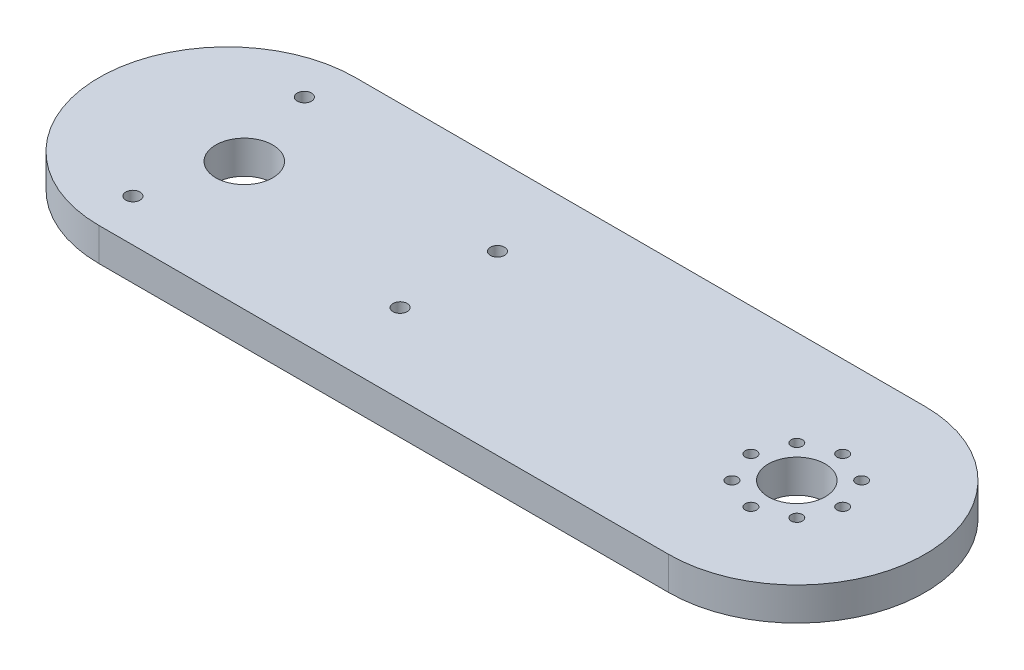
ISO-10303-21;
HEADER;
FILE_DESCRIPTION(('STEP AP214'),'2;1');
FILE_NAME('part.step','',(''),(''),'','','');
FILE_SCHEMA(('AUTOMOTIVE_DESIGN { 1 0 10303 214 1 1 1 1 }'));
ENDSEC;
DATA;
#1=APPLICATION_CONTEXT('core data for automotive mechanical design processes');
#2=APPLICATION_PROTOCOL_DEFINITION('international standard','automotive_design',2000,#1);
#3=PRODUCT_CONTEXT('',#1,'mechanical');
#4=PRODUCT('Part','Part','',(#3));
#5=PRODUCT_RELATED_PRODUCT_CATEGORY('part','',(#4));
#6=PRODUCT_DEFINITION_FORMATION('','',#4);
#7=PRODUCT_DEFINITION_CONTEXT('part definition',#1,'design');
#8=PRODUCT_DEFINITION('design','',#6,#7);
#9=PRODUCT_DEFINITION_SHAPE('','',#8);
#10=(LENGTH_UNIT() NAMED_UNIT(*) SI_UNIT(.MILLI.,.METRE.));
#11=(NAMED_UNIT(*) PLANE_ANGLE_UNIT() SI_UNIT($,.RADIAN.));
#12=(NAMED_UNIT(*) SI_UNIT($,.STERADIAN.) SOLID_ANGLE_UNIT());
#13=UNCERTAINTY_MEASURE_WITH_UNIT(LENGTH_MEASURE(1.E-05),#10,'distance_accuracy_value','');
#14=(GEOMETRIC_REPRESENTATION_CONTEXT(3) GLOBAL_UNCERTAINTY_ASSIGNED_CONTEXT((#13)) GLOBAL_UNIT_ASSIGNED_CONTEXT((#10,
#11,#12)) REPRESENTATION_CONTEXT('',''));
#15=CARTESIAN_POINT('',(0.,0.,0.));
#16=DIRECTION('',(0.,0.,1.));
#17=DIRECTION('',(1.,0.,0.));
#18=AXIS2_PLACEMENT_3D('',#15,#16,#17);
#19=CARTESIAN_POINT('',(50.,2.9,0.));
#20=DIRECTION('',(0.,-1.,0.));
#21=DIRECTION('',(0.,0.,-1.));
#22=AXIS2_PLACEMENT_3D('',#19,#20,#21);
#23=CYLINDRICAL_SURFACE('',#22,22.5);
#24=CARTESIAN_POINT('',(50.,-2.9,0.));
#25=DIRECTION('',(0.,1.,0.));
#26=DIRECTION('',(0.,0.,1.));
#27=AXIS2_PLACEMENT_3D('',#24,#25,#26);
#28=CIRCLE('',#27,22.5);
#29=CARTESIAN_POINT('',(50.,-2.9,22.5));
#30=VERTEX_POINT('',#29);
#31=CARTESIAN_POINT('',(50.,-2.9,-22.5));
#32=VERTEX_POINT('',#31);
#33=EDGE_CURVE('E107',#30,#32,#28,.T.);
#34=ORIENTED_EDGE('',*,*,#33,.T.);
#35=DIRECTION('',(0.,-1.,0.));
#36=VECTOR('',#35,1.);
#37=CARTESIAN_POINT('',(50.,2.9,-22.5));
#38=LINE('',#37,#36);
#39=CARTESIAN_POINT('',(50.,2.9,-22.5));
#40=VERTEX_POINT('',#39);
#41=EDGE_CURVE('E11',#40,#32,#38,.T.);
#42=ORIENTED_EDGE('',*,*,#41,.F.);
#43=CARTESIAN_POINT('',(50.,2.9,0.));
#44=DIRECTION('',(0.,1.,0.));
#45=DIRECTION('',(0.,0.,1.));
#46=AXIS2_PLACEMENT_3D('',#43,#44,#45);
#47=CIRCLE('',#46,22.5);
#48=CARTESIAN_POINT('',(50.,2.9,22.5));
#49=VERTEX_POINT('',#48);
#50=EDGE_CURVE('E91',#49,#40,#47,.T.);
#51=ORIENTED_EDGE('',*,*,#50,.F.);
#52=DIRECTION('',(0.,-1.,0.));
#53=VECTOR('',#52,1.);
#54=CARTESIAN_POINT('',(50.,2.9,22.5));
#55=LINE('',#54,#53);
#56=EDGE_CURVE('E103',#49,#30,#55,.T.);
#57=ORIENTED_EDGE('',*,*,#56,.T.);
#58=EDGE_LOOP('',(#34,#42,#51,#57));
#59=FACE_BOUND('',#58,.T.);
#60=ADVANCED_FACE('F39',(#59),#23,.T.);
#61=CARTESIAN_POINT('',(50.,2.9,-22.5));
#62=DIRECTION('',(0.,0.,1.));
#63=DIRECTION('',(1.,0.,0.));
#64=AXIS2_PLACEMENT_3D('',#61,#62,#63);
#65=PLANE('',#64);
#66=DIRECTION('',(-1.,0.,0.));
#67=VECTOR('',#66,1.);
#68=CARTESIAN_POINT('',(50.,-2.9,-22.5));
#69=LINE('',#68,#67);
#70=CARTESIAN_POINT('',(-50.,-2.9,-22.5));
#71=VERTEX_POINT('',#70);
#72=EDGE_CURVE('E96',#32,#71,#69,.T.);
#73=ORIENTED_EDGE('',*,*,#72,.T.);
#74=DIRECTION('',(0.,-1.,0.));
#75=VECTOR('',#74,1.);
#76=CARTESIAN_POINT('',(-50.,2.9,-22.5));
#77=LINE('',#76,#75);
#78=CARTESIAN_POINT('',(-50.,2.9,-22.5));
#79=VERTEX_POINT('',#78);
#80=EDGE_CURVE('E48',#79,#71,#77,.T.);
#81=ORIENTED_EDGE('',*,*,#80,.F.);
#82=DIRECTION('',(-1.,0.,0.));
#83=VECTOR('',#82,1.);
#84=CARTESIAN_POINT('',(50.,2.9,-22.5));
#85=LINE('',#84,#83);
#86=EDGE_CURVE('E86',#40,#79,#85,.T.);
#87=ORIENTED_EDGE('',*,*,#86,.F.);
#88=ORIENTED_EDGE('',*,*,#41,.T.);
#89=EDGE_LOOP('',(#73,#81,#87,#88));
#90=FACE_BOUND('',#89,.T.);
#91=ADVANCED_FACE('F95',(#90),#65,.F.);
#92=CARTESIAN_POINT('',(-50.,2.9,0.));
#93=DIRECTION('',(0.,-1.,0.));
#94=DIRECTION('',(0.,0.,-1.));
#95=AXIS2_PLACEMENT_3D('',#92,#93,#94);
#96=CYLINDRICAL_SURFACE('',#95,22.5);
#97=CARTESIAN_POINT('',(-50.,-2.9,0.));
#98=DIRECTION('',(0.,1.,0.));
#99=DIRECTION('',(0.,0.,1.));
#100=AXIS2_PLACEMENT_3D('',#97,#98,#99);
#101=CIRCLE('',#100,22.5);
#102=CARTESIAN_POINT('',(-50.,-2.9,22.5));
#103=VERTEX_POINT('',#102);
#104=EDGE_CURVE('E73',#71,#103,#101,.T.);
#105=ORIENTED_EDGE('',*,*,#104,.T.);
#106=DIRECTION('',(0.,-1.,0.));
#107=VECTOR('',#106,1.);
#108=CARTESIAN_POINT('',(-50.,2.9,22.5));
#109=LINE('',#108,#107);
#110=CARTESIAN_POINT('',(-50.,2.9,22.5));
#111=VERTEX_POINT('',#110);
#112=EDGE_CURVE('E98',#111,#103,#109,.T.);
#113=ORIENTED_EDGE('',*,*,#112,.F.);
#114=CARTESIAN_POINT('',(-50.,2.9,0.));
#115=DIRECTION('',(0.,1.,0.));
#116=DIRECTION('',(0.,0.,1.));
#117=AXIS2_PLACEMENT_3D('',#114,#115,#116);
#118=CIRCLE('',#117,22.5);
#119=EDGE_CURVE('E89',#79,#111,#118,.T.);
#120=ORIENTED_EDGE('',*,*,#119,.F.);
#121=ORIENTED_EDGE('',*,*,#80,.T.);
#122=EDGE_LOOP('',(#105,#113,#120,#121));
#123=FACE_BOUND('',#122,.T.);
#124=ADVANCED_FACE('F99',(#123),#96,.T.);
#125=CARTESIAN_POINT('',(50.,2.9,22.5));
#126=DIRECTION('',(0.,0.,-1.));
#127=DIRECTION('',(-1.,0.,0.));
#128=AXIS2_PLACEMENT_3D('',#125,#126,#127);
#129=PLANE('',#128);
#130=DIRECTION('',(1.,0.,0.));
#131=VECTOR('',#130,1.);
#132=CARTESIAN_POINT('',(50.,-2.9,22.5));
#133=LINE('',#132,#131);
#134=EDGE_CURVE('E79',#103,#30,#133,.T.);
#135=ORIENTED_EDGE('',*,*,#134,.T.);
#136=ORIENTED_EDGE('',*,*,#56,.F.);
#137=DIRECTION('',(1.,0.,0.));
#138=VECTOR('',#137,1.);
#139=CARTESIAN_POINT('',(50.,2.9,22.5));
#140=LINE('',#139,#138);
#141=EDGE_CURVE('E56',#111,#49,#140,.T.);
#142=ORIENTED_EDGE('',*,*,#141,.F.);
#143=ORIENTED_EDGE('',*,*,#112,.T.);
#144=EDGE_LOOP('',(#135,#136,#142,#143));
#145=FACE_BOUND('',#144,.T.);
#146=ADVANCED_FACE('F121',(#145),#129,.F.);
#147=CARTESIAN_POINT('',(50.,2.9,0.));
#148=DIRECTION('',(0.,1.,0.));
#149=DIRECTION('',(0.,0.,1.));
#150=AXIS2_PLACEMENT_3D('',#147,#148,#149);
#151=PLANE('',#150);
#152=CARTESIAN_POINT('',(-51.5,2.9,15.05));
#153=DIRECTION('',(0.,1.,0.));
#154=DIRECTION('',(0.,0.,1.));
#155=AXIS2_PLACEMENT_3D('',#152,#153,#154);
#156=CIRCLE('',#155,1.25);
#157=CARTESIAN_POINT('',(-51.5,2.9,16.3));
#158=VERTEX_POINT('',#157);
#159=EDGE_CURVE('E196',#158,#158,#156,.T.);
#160=ORIENTED_EDGE('',*,*,#159,.F.);
#161=EDGE_LOOP('',(#160));
#162=FACE_BOUND('',#161,.T.);
#163=CARTESIAN_POINT('',(-47.,2.9,0.));
#164=DIRECTION('',(0.,1.,0.));
#165=DIRECTION('',(0.,0.,1.));
#166=AXIS2_PLACEMENT_3D('',#163,#164,#165);
#167=CIRCLE('',#166,5.);
#168=CARTESIAN_POINT('',(-47.,2.9,5.));
#169=VERTEX_POINT('',#168);
#170=EDGE_CURVE('E203',#169,#169,#167,.T.);
#171=ORIENTED_EDGE('',*,*,#170,.F.);
#172=EDGE_LOOP('',(#171));
#173=FACE_BOUND('',#172,.T.);
#174=CARTESIAN_POINT('',(-11.1,2.9,-8.55));
#175=DIRECTION('',(0.,1.,0.));
#176=DIRECTION('',(0.,0.,1.));
#177=AXIS2_PLACEMENT_3D('',#174,#175,#176);
#178=CIRCLE('',#177,1.25);
#179=CARTESIAN_POINT('',(-11.1,2.9,-7.3));
#180=VERTEX_POINT('',#179);
#181=EDGE_CURVE('E207',#180,#180,#178,.T.);
#182=ORIENTED_EDGE('',*,*,#181,.F.);
#183=EDGE_LOOP('',(#182));
#184=FACE_BOUND('',#183,.T.);
#185=CARTESIAN_POINT('',(-11.1,2.9,8.55));
#186=DIRECTION('',(0.,1.,0.));
#187=DIRECTION('',(0.,0.,1.));
#188=AXIS2_PLACEMENT_3D('',#185,#186,#187);
#189=CIRCLE('',#188,1.25);
#190=CARTESIAN_POINT('',(-11.1,2.9,9.8));
#191=VERTEX_POINT('',#190);
#192=EDGE_CURVE('E211',#191,#191,#189,.T.);
#193=ORIENTED_EDGE('',*,*,#192,.F.);
#194=EDGE_LOOP('',(#193));
#195=FACE_BOUND('',#194,.T.);
#196=CARTESIAN_POINT('',(-51.5,2.9,-15.05));
#197=DIRECTION('',(0.,1.,0.));
#198=DIRECTION('',(0.,0.,1.));
#199=AXIS2_PLACEMENT_3D('',#196,#197,#198);
#200=CIRCLE('',#199,1.25);
#201=CARTESIAN_POINT('',(-51.5,2.9,-13.8));
#202=VERTEX_POINT('',#201);
#203=EDGE_CURVE('E215',#202,#202,#200,.T.);
#204=ORIENTED_EDGE('',*,*,#203,.F.);
#205=EDGE_LOOP('',(#204));
#206=FACE_BOUND('',#205,.T.);
#207=CARTESIAN_POINT('',(50.,2.9,0.));
#208=DIRECTION('',(0.,1.,0.));
#209=DIRECTION('',(0.,0.,1.));
#210=AXIS2_PLACEMENT_3D('',#207,#208,#209);
#211=CIRCLE('',#210,5.);
#212=CARTESIAN_POINT('',(50.,2.9,4.99999999999998));
#213=VERTEX_POINT('',#212);
#214=EDGE_CURVE('E192',#213,#213,#211,.T.);
#215=ORIENTED_EDGE('',*,*,#214,.F.);
#216=EDGE_LOOP('',(#215));
#217=FACE_BOUND('',#216,.T.);
#218=CARTESIAN_POINT('',(41.95,2.9,0.));
#219=DIRECTION('',(0.,1.,0.));
#220=DIRECTION('',(0.,0.,1.));
#221=AXIS2_PLACEMENT_3D('',#218,#219,#220);
#222=CIRCLE('',#221,0.989999999999994);
#223=CARTESIAN_POINT('',(41.95,2.9,0.989999999999994));
#224=VERTEX_POINT('',#223);
#225=EDGE_CURVE('E111',#224,#224,#222,.T.);
#226=ORIENTED_EDGE('',*,*,#225,.F.);
#227=EDGE_LOOP('',(#226));
#228=FACE_BOUND('',#227,.T.);
#229=CARTESIAN_POINT('',(44.3077904114483,2.9,-5.69220958855171));
#230=DIRECTION('',(0.,1.,0.));
#231=DIRECTION('',(0.,0.,1.));
#232=AXIS2_PLACEMENT_3D('',#229,#230,#231);
#233=CIRCLE('',#232,0.989999999999994);
#234=CARTESIAN_POINT('',(44.3077904114483,2.9,-4.70220958855171));
#235=VERTEX_POINT('',#234);
#236=EDGE_CURVE('E131',#235,#235,#233,.T.);
#237=ORIENTED_EDGE('',*,*,#236,.F.);
#238=EDGE_LOOP('',(#237));
#239=FACE_BOUND('',#238,.T.);
#240=CARTESIAN_POINT('',(50.,2.9,-8.05));
#241=DIRECTION('',(0.,1.,0.));
#242=DIRECTION('',(0.,0.,1.));
#243=AXIS2_PLACEMENT_3D('',#240,#241,#242);
#244=CIRCLE('',#243,0.989999999999994);
#245=CARTESIAN_POINT('',(50.,2.9,-7.06000000000001));
#246=VERTEX_POINT('',#245);
#247=EDGE_CURVE('E135',#246,#246,#244,.T.);
#248=ORIENTED_EDGE('',*,*,#247,.F.);
#249=EDGE_LOOP('',(#248));
#250=FACE_BOUND('',#249,.T.);
#251=CARTESIAN_POINT('',(55.6922095885517,2.9,-5.69220958855171));
#252=DIRECTION('',(0.,1.,0.));
#253=DIRECTION('',(0.,0.,1.));
#254=AXIS2_PLACEMENT_3D('',#251,#252,#253);
#255=CIRCLE('',#254,0.989999999999994);
#256=CARTESIAN_POINT('',(55.6922095885517,2.9,-4.70220958855172));
#257=VERTEX_POINT('',#256);
#258=EDGE_CURVE('E139',#257,#257,#255,.T.);
#259=ORIENTED_EDGE('',*,*,#258,.F.);
#260=EDGE_LOOP('',(#259));
#261=FACE_BOUND('',#260,.T.);
#262=CARTESIAN_POINT('',(58.05,2.9,0.));
#263=DIRECTION('',(0.,1.,0.));
#264=DIRECTION('',(0.,0.,1.));
#265=AXIS2_PLACEMENT_3D('',#262,#263,#264);
#266=CIRCLE('',#265,0.989999999999994);
#267=CARTESIAN_POINT('',(58.05,2.9,0.989999999999991));
#268=VERTEX_POINT('',#267);
#269=EDGE_CURVE('E143',#268,#268,#266,.T.);
#270=ORIENTED_EDGE('',*,*,#269,.F.);
#271=EDGE_LOOP('',(#270));
#272=FACE_BOUND('',#271,.T.);
#273=CARTESIAN_POINT('',(55.6922095885517,2.9,5.69220958855171));
#274=DIRECTION('',(0.,1.,0.));
#275=DIRECTION('',(0.,0.,1.));
#276=AXIS2_PLACEMENT_3D('',#273,#274,#275);
#277=CIRCLE('',#276,0.990000000000001);
#278=CARTESIAN_POINT('',(55.6922095885517,2.9,6.68220958855171));
#279=VERTEX_POINT('',#278);
#280=EDGE_CURVE('E147',#279,#279,#277,.T.);
#281=ORIENTED_EDGE('',*,*,#280,.F.);
#282=EDGE_LOOP('',(#281));
#283=FACE_BOUND('',#282,.T.);
#284=CARTESIAN_POINT('',(50.,2.9,8.05));
#285=DIRECTION('',(0.,1.,0.));
#286=DIRECTION('',(0.,0.,1.));
#287=AXIS2_PLACEMENT_3D('',#284,#285,#286);
#288=CIRCLE('',#287,0.989999999999994);
#289=CARTESIAN_POINT('',(50.,2.9,9.04));
#290=VERTEX_POINT('',#289);
#291=EDGE_CURVE('E151',#290,#290,#288,.T.);
#292=ORIENTED_EDGE('',*,*,#291,.F.);
#293=EDGE_LOOP('',(#292));
#294=FACE_BOUND('',#293,.T.);
#295=CARTESIAN_POINT('',(44.3077904114483,2.9,5.69220958855171));
#296=DIRECTION('',(0.,1.,0.));
#297=DIRECTION('',(0.,0.,1.));
#298=AXIS2_PLACEMENT_3D('',#295,#296,#297);
#299=CIRCLE('',#298,0.989999999999994);
#300=CARTESIAN_POINT('',(44.3077904114483,2.9,6.6822095885517));
#301=VERTEX_POINT('',#300);
#302=EDGE_CURVE('E155',#301,#301,#299,.T.);
#303=ORIENTED_EDGE('',*,*,#302,.F.);
#304=EDGE_LOOP('',(#303));
#305=FACE_BOUND('',#304,.T.);
#306=ORIENTED_EDGE('',*,*,#50,.T.);
#307=ORIENTED_EDGE('',*,*,#86,.T.);
#308=ORIENTED_EDGE('',*,*,#119,.T.);
#309=ORIENTED_EDGE('',*,*,#141,.T.);
#310=EDGE_LOOP('',(#306,#307,#308,#309));
#311=FACE_BOUND('',#310,.T.);
#312=ADVANCED_FACE('F87',(#162,#173,#184,#195,#206,#217,#228,#239,#250,#261,#272,#283,#294,#305,
#311),#151,.T.);
#313=CARTESIAN_POINT('',(50.,-2.9,0.));
#314=DIRECTION('',(0.,1.,0.));
#315=DIRECTION('',(0.,0.,1.));
#316=AXIS2_PLACEMENT_3D('',#313,#314,#315);
#317=PLANE('',#316);
#318=CARTESIAN_POINT('',(-51.5,-2.9,15.05));
#319=DIRECTION('',(0.,1.,0.));
#320=DIRECTION('',(0.,0.,1.));
#321=AXIS2_PLACEMENT_3D('',#318,#319,#320);
#322=CIRCLE('',#321,1.25);
#323=CARTESIAN_POINT('',(-51.5,-2.9,16.3));
#324=VERTEX_POINT('',#323);
#325=EDGE_CURVE('E219',#324,#324,#322,.T.);
#326=ORIENTED_EDGE('',*,*,#325,.T.);
#327=EDGE_LOOP('',(#326));
#328=FACE_BOUND('',#327,.T.);
#329=CARTESIAN_POINT('',(-47.,-2.9,0.));
#330=DIRECTION('',(0.,1.,0.));
#331=DIRECTION('',(0.,0.,1.));
#332=AXIS2_PLACEMENT_3D('',#329,#330,#331);
#333=CIRCLE('',#332,5.);
#334=CARTESIAN_POINT('',(-47.,-2.9,5.));
#335=VERTEX_POINT('',#334);
#336=EDGE_CURVE('E229',#335,#335,#333,.T.);
#337=ORIENTED_EDGE('',*,*,#336,.T.);
#338=EDGE_LOOP('',(#337));
#339=FACE_BOUND('',#338,.T.);
#340=CARTESIAN_POINT('',(-11.1,-2.9,-8.55));
#341=DIRECTION('',(0.,1.,0.));
#342=DIRECTION('',(0.,0.,1.));
#343=AXIS2_PLACEMENT_3D('',#340,#341,#342);
#344=CIRCLE('',#343,1.25);
#345=CARTESIAN_POINT('',(-11.1,-2.9,-7.3));
#346=VERTEX_POINT('',#345);
#347=EDGE_CURVE('E225',#346,#346,#344,.T.);
#348=ORIENTED_EDGE('',*,*,#347,.T.);
#349=EDGE_LOOP('',(#348));
#350=FACE_BOUND('',#349,.T.);
#351=CARTESIAN_POINT('',(-11.1,-2.9,8.55));
#352=DIRECTION('',(0.,1.,0.));
#353=DIRECTION('',(0.,0.,-1.));
#354=AXIS2_PLACEMENT_3D('',#351,#352,#353);
#355=CIRCLE('',#354,1.25);
#356=CARTESIAN_POINT('',(-11.1,-2.9,7.30000000000001));
#357=VERTEX_POINT('',#356);
#358=EDGE_CURVE('E220',#357,#357,#355,.T.);
#359=ORIENTED_EDGE('',*,*,#358,.T.);
#360=EDGE_LOOP('',(#359));
#361=FACE_BOUND('',#360,.T.);
#362=CARTESIAN_POINT('',(-51.5,-2.9,-15.05));
#363=DIRECTION('',(0.,1.,0.));
#364=DIRECTION('',(0.,0.,1.));
#365=AXIS2_PLACEMENT_3D('',#362,#363,#364);
#366=CIRCLE('',#365,1.25);
#367=CARTESIAN_POINT('',(-51.5,-2.9,-13.8));
#368=VERTEX_POINT('',#367);
#369=EDGE_CURVE('E224',#368,#368,#366,.T.);
#370=ORIENTED_EDGE('',*,*,#369,.T.);
#371=EDGE_LOOP('',(#370));
#372=FACE_BOUND('',#371,.T.);
#373=CARTESIAN_POINT('',(50.,-2.9,0.));
#374=DIRECTION('',(0.,1.,0.));
#375=DIRECTION('',(0.,0.,1.));
#376=AXIS2_PLACEMENT_3D('',#373,#374,#375);
#377=CIRCLE('',#376,5.);
#378=CARTESIAN_POINT('',(50.,-2.9,4.99999999999998));
#379=VERTEX_POINT('',#378);
#380=EDGE_CURVE('E165',#379,#379,#377,.T.);
#381=ORIENTED_EDGE('',*,*,#380,.T.);
#382=EDGE_LOOP('',(#381));
#383=FACE_BOUND('',#382,.T.);
#384=CARTESIAN_POINT('',(41.95,-2.9,0.));
#385=DIRECTION('',(0.,1.,0.));
#386=DIRECTION('',(0.,0.,1.));
#387=AXIS2_PLACEMENT_3D('',#384,#385,#386);
#388=CIRCLE('',#387,0.989999999999994);
#389=CARTESIAN_POINT('',(41.95,-2.9,0.989999999999994));
#390=VERTEX_POINT('',#389);
#391=EDGE_CURVE('E159',#390,#390,#388,.T.);
#392=ORIENTED_EDGE('',*,*,#391,.T.);
#393=EDGE_LOOP('',(#392));
#394=FACE_BOUND('',#393,.T.);
#395=CARTESIAN_POINT('',(44.3077904114483,-2.9,-5.69220958855171));
#396=DIRECTION('',(0.,1.,0.));
#397=DIRECTION('',(0.,0.,1.));
#398=AXIS2_PLACEMENT_3D('',#395,#396,#397);
#399=CIRCLE('',#398,0.989999999999994);
#400=CARTESIAN_POINT('',(44.3077904114483,-2.9,-4.70220958855171));
#401=VERTEX_POINT('',#400);
#402=EDGE_CURVE('E185',#401,#401,#399,.T.);
#403=ORIENTED_EDGE('',*,*,#402,.T.);
#404=EDGE_LOOP('',(#403));
#405=FACE_BOUND('',#404,.T.);
#406=CARTESIAN_POINT('',(50.,-2.9,-8.05));
#407=DIRECTION('',(0.,1.,0.));
#408=DIRECTION('',(0.,0.,1.));
#409=AXIS2_PLACEMENT_3D('',#406,#407,#408);
#410=CIRCLE('',#409,0.989999999999994);
#411=CARTESIAN_POINT('',(50.,-2.9,-7.06000000000001));
#412=VERTEX_POINT('',#411);
#413=EDGE_CURVE('E181',#412,#412,#410,.T.);
#414=ORIENTED_EDGE('',*,*,#413,.T.);
#415=EDGE_LOOP('',(#414));
#416=FACE_BOUND('',#415,.T.);
#417=CARTESIAN_POINT('',(55.6922095885517,-2.9,-5.69220958855171));
#418=DIRECTION('',(0.,1.,0.));
#419=DIRECTION('',(0.,0.,1.));
#420=AXIS2_PLACEMENT_3D('',#417,#418,#419);
#421=CIRCLE('',#420,0.989999999999994);
#422=CARTESIAN_POINT('',(55.6922095885517,-2.9,-4.70220958855172));
#423=VERTEX_POINT('',#422);
#424=EDGE_CURVE('E177',#423,#423,#421,.T.);
#425=ORIENTED_EDGE('',*,*,#424,.T.);
#426=EDGE_LOOP('',(#425));
#427=FACE_BOUND('',#426,.T.);
#428=CARTESIAN_POINT('',(58.05,-2.9,0.));
#429=DIRECTION('',(0.,1.,0.));
#430=DIRECTION('',(0.,0.,1.));
#431=AXIS2_PLACEMENT_3D('',#428,#429,#430);
#432=CIRCLE('',#431,0.989999999999994);
#433=CARTESIAN_POINT('',(58.05,-2.9,0.989999999999991));
#434=VERTEX_POINT('',#433);
#435=EDGE_CURVE('E173',#434,#434,#432,.T.);
#436=ORIENTED_EDGE('',*,*,#435,.T.);
#437=EDGE_LOOP('',(#436));
#438=FACE_BOUND('',#437,.T.);
#439=CARTESIAN_POINT('',(55.6922095885517,-2.9,5.69220958855171));
#440=DIRECTION('',(0.,1.,0.));
#441=DIRECTION('',(0.,0.,1.));
#442=AXIS2_PLACEMENT_3D('',#439,#440,#441);
#443=CIRCLE('',#442,0.990000000000001);
#444=CARTESIAN_POINT('',(55.6922095885517,-2.9,6.68220958855171));
#445=VERTEX_POINT('',#444);
#446=EDGE_CURVE('E169',#445,#445,#443,.T.);
#447=ORIENTED_EDGE('',*,*,#446,.T.);
#448=EDGE_LOOP('',(#447));
#449=FACE_BOUND('',#448,.T.);
#450=CARTESIAN_POINT('',(50.,-2.9,8.05));
#451=DIRECTION('',(0.,1.,0.));
#452=DIRECTION('',(0.,0.,1.));
#453=AXIS2_PLACEMENT_3D('',#450,#451,#452);
#454=CIRCLE('',#453,0.989999999999994);
#455=CARTESIAN_POINT('',(50.,-2.9,9.04));
#456=VERTEX_POINT('',#455);
#457=EDGE_CURVE('E164',#456,#456,#454,.T.);
#458=ORIENTED_EDGE('',*,*,#457,.T.);
#459=EDGE_LOOP('',(#458));
#460=FACE_BOUND('',#459,.T.);
#461=CARTESIAN_POINT('',(44.3077904114483,-2.9,5.69220958855171));
#462=DIRECTION('',(0.,1.,0.));
#463=DIRECTION('',(0.,0.,1.));
#464=AXIS2_PLACEMENT_3D('',#461,#462,#463);
#465=CIRCLE('',#464,0.989999999999994);
#466=CARTESIAN_POINT('',(44.3077904114483,-2.9,6.6822095885517));
#467=VERTEX_POINT('',#466);
#468=EDGE_CURVE('E160',#467,#467,#465,.T.);
#469=ORIENTED_EDGE('',*,*,#468,.T.);
#470=EDGE_LOOP('',(#469));
#471=FACE_BOUND('',#470,.T.);
#472=ORIENTED_EDGE('',*,*,#33,.F.);
#473=ORIENTED_EDGE('',*,*,#134,.F.);
#474=ORIENTED_EDGE('',*,*,#104,.F.);
#475=ORIENTED_EDGE('',*,*,#72,.F.);
#476=EDGE_LOOP('',(#472,#473,#474,#475));
#477=FACE_BOUND('',#476,.T.);
#478=ADVANCED_FACE('F124',(#328,#339,#350,#361,#372,#383,#394,#405,#416,#427,#438,#449,#460,
#471,#477),#317,.F.);
#479=CARTESIAN_POINT('',(44.3077904114483,-2.9,5.69220958855171));
#480=DIRECTION('',(0.,1.,0.));
#481=DIRECTION('',(0.,0.,1.));
#482=AXIS2_PLACEMENT_3D('',#479,#480,#481);
#483=CYLINDRICAL_SURFACE('',#482,0.989999999999994);
#484=ORIENTED_EDGE('',*,*,#302,.T.);
#485=EDGE_LOOP('',(#484));
#486=FACE_BOUND('',#485,.T.);
#487=ORIENTED_EDGE('',*,*,#468,.F.);
#488=EDGE_LOOP('',(#487));
#489=FACE_BOUND('',#488,.T.);
#490=ADVANCED_FACE('F267',(#486,#489),#483,.F.);
#491=CARTESIAN_POINT('',(50.,-2.9,8.05));
#492=DIRECTION('',(0.,1.,0.));
#493=DIRECTION('',(0.,0.,1.));
#494=AXIS2_PLACEMENT_3D('',#491,#492,#493);
#495=CYLINDRICAL_SURFACE('',#494,0.989999999999994);
#496=ORIENTED_EDGE('',*,*,#291,.T.);
#497=EDGE_LOOP('',(#496));
#498=FACE_BOUND('',#497,.T.);
#499=ORIENTED_EDGE('',*,*,#457,.F.);
#500=EDGE_LOOP('',(#499));
#501=FACE_BOUND('',#500,.T.);
#502=ADVANCED_FACE('F273',(#498,#501),#495,.F.);
#503=CARTESIAN_POINT('',(55.6922095885517,-2.9,5.69220958855171));
#504=DIRECTION('',(0.,1.,0.));
#505=DIRECTION('',(0.,0.,1.));
#506=AXIS2_PLACEMENT_3D('',#503,#504,#505);
#507=CYLINDRICAL_SURFACE('',#506,0.990000000000001);
#508=ORIENTED_EDGE('',*,*,#280,.T.);
#509=EDGE_LOOP('',(#508));
#510=FACE_BOUND('',#509,.T.);
#511=ORIENTED_EDGE('',*,*,#446,.F.);
#512=EDGE_LOOP('',(#511));
#513=FACE_BOUND('',#512,.T.);
#514=ADVANCED_FACE('F277',(#510,#513),#507,.F.);
#515=CARTESIAN_POINT('',(58.05,-2.9,0.));
#516=DIRECTION('',(0.,1.,0.));
#517=DIRECTION('',(0.,0.,1.));
#518=AXIS2_PLACEMENT_3D('',#515,#516,#517);
#519=CYLINDRICAL_SURFACE('',#518,0.989999999999994);
#520=ORIENTED_EDGE('',*,*,#269,.T.);
#521=EDGE_LOOP('',(#520));
#522=FACE_BOUND('',#521,.T.);
#523=ORIENTED_EDGE('',*,*,#435,.F.);
#524=EDGE_LOOP('',(#523));
#525=FACE_BOUND('',#524,.T.);
#526=ADVANCED_FACE('F281',(#522,#525),#519,.F.);
#527=CARTESIAN_POINT('',(55.6922095885517,-2.9,-5.69220958855171));
#528=DIRECTION('',(0.,1.,0.));
#529=DIRECTION('',(0.,0.,1.));
#530=AXIS2_PLACEMENT_3D('',#527,#528,#529);
#531=CYLINDRICAL_SURFACE('',#530,0.989999999999994);
#532=ORIENTED_EDGE('',*,*,#258,.T.);
#533=EDGE_LOOP('',(#532));
#534=FACE_BOUND('',#533,.T.);
#535=ORIENTED_EDGE('',*,*,#424,.F.);
#536=EDGE_LOOP('',(#535));
#537=FACE_BOUND('',#536,.T.);
#538=ADVANCED_FACE('F285',(#534,#537),#531,.F.);
#539=CARTESIAN_POINT('',(50.,-2.9,-8.05));
#540=DIRECTION('',(0.,1.,0.));
#541=DIRECTION('',(0.,0.,1.));
#542=AXIS2_PLACEMENT_3D('',#539,#540,#541);
#543=CYLINDRICAL_SURFACE('',#542,0.989999999999994);
#544=ORIENTED_EDGE('',*,*,#247,.T.);
#545=EDGE_LOOP('',(#544));
#546=FACE_BOUND('',#545,.T.);
#547=ORIENTED_EDGE('',*,*,#413,.F.);
#548=EDGE_LOOP('',(#547));
#549=FACE_BOUND('',#548,.T.);
#550=ADVANCED_FACE('F289',(#546,#549),#543,.F.);
#551=CARTESIAN_POINT('',(44.3077904114483,-2.9,-5.69220958855171));
#552=DIRECTION('',(0.,1.,0.));
#553=DIRECTION('',(0.,0.,1.));
#554=AXIS2_PLACEMENT_3D('',#551,#552,#553);
#555=CYLINDRICAL_SURFACE('',#554,0.989999999999994);
#556=ORIENTED_EDGE('',*,*,#236,.T.);
#557=EDGE_LOOP('',(#556));
#558=FACE_BOUND('',#557,.T.);
#559=ORIENTED_EDGE('',*,*,#402,.F.);
#560=EDGE_LOOP('',(#559));
#561=FACE_BOUND('',#560,.T.);
#562=ADVANCED_FACE('F293',(#558,#561),#555,.F.);
#563=CARTESIAN_POINT('',(41.95,-2.9,0.));
#564=DIRECTION('',(0.,1.,0.));
#565=DIRECTION('',(0.,0.,1.));
#566=AXIS2_PLACEMENT_3D('',#563,#564,#565);
#567=CYLINDRICAL_SURFACE('',#566,0.989999999999994);
#568=ORIENTED_EDGE('',*,*,#225,.T.);
#569=EDGE_LOOP('',(#568));
#570=FACE_BOUND('',#569,.T.);
#571=ORIENTED_EDGE('',*,*,#391,.F.);
#572=EDGE_LOOP('',(#571));
#573=FACE_BOUND('',#572,.T.);
#574=ADVANCED_FACE('F297',(#570,#573),#567,.F.);
#575=CARTESIAN_POINT('',(50.,-2.9,0.));
#576=DIRECTION('',(0.,1.,0.));
#577=DIRECTION('',(0.,0.,1.));
#578=AXIS2_PLACEMENT_3D('',#575,#576,#577);
#579=CYLINDRICAL_SURFACE('',#578,5.);
#580=ORIENTED_EDGE('',*,*,#380,.F.);
#581=EDGE_LOOP('',(#580));
#582=FACE_BOUND('',#581,.T.);
#583=ORIENTED_EDGE('',*,*,#214,.T.);
#584=EDGE_LOOP('',(#583));
#585=FACE_BOUND('',#584,.T.);
#586=ADVANCED_FACE('F301',(#582,#585),#579,.F.);
#587=CARTESIAN_POINT('',(-51.5,-2.9,-15.05));
#588=DIRECTION('',(0.,1.,0.));
#589=DIRECTION('',(0.,0.,1.));
#590=AXIS2_PLACEMENT_3D('',#587,#588,#589);
#591=CYLINDRICAL_SURFACE('',#590,1.25);
#592=ORIENTED_EDGE('',*,*,#203,.T.);
#593=EDGE_LOOP('',(#592));
#594=FACE_BOUND('',#593,.T.);
#595=ORIENTED_EDGE('',*,*,#369,.F.);
#596=EDGE_LOOP('',(#595));
#597=FACE_BOUND('',#596,.T.);
#598=ADVANCED_FACE('F305',(#594,#597),#591,.F.);
#599=CARTESIAN_POINT('',(-11.1,-2.9,8.55));
#600=DIRECTION('',(0.,1.,0.));
#601=DIRECTION('',(0.,0.,1.));
#602=AXIS2_PLACEMENT_3D('',#599,#600,#601);
#603=CYLINDRICAL_SURFACE('',#602,1.25);
#604=ORIENTED_EDGE('',*,*,#192,.T.);
#605=EDGE_LOOP('',(#604));
#606=FACE_BOUND('',#605,.T.);
#607=ORIENTED_EDGE('',*,*,#358,.F.);
#608=EDGE_LOOP('',(#607));
#609=FACE_BOUND('',#608,.T.);
#610=ADVANCED_FACE('F307',(#606,#609),#603,.F.);
#611=CARTESIAN_POINT('',(-11.1,-2.9,-8.55));
#612=DIRECTION('',(0.,1.,0.));
#613=DIRECTION('',(0.,0.,1.));
#614=AXIS2_PLACEMENT_3D('',#611,#612,#613);
#615=CYLINDRICAL_SURFACE('',#614,1.25);
#616=ORIENTED_EDGE('',*,*,#181,.T.);
#617=EDGE_LOOP('',(#616));
#618=FACE_BOUND('',#617,.T.);
#619=ORIENTED_EDGE('',*,*,#347,.F.);
#620=EDGE_LOOP('',(#619));
#621=FACE_BOUND('',#620,.T.);
#622=ADVANCED_FACE('F250',(#618,#621),#615,.F.);
#623=CARTESIAN_POINT('',(-47.,-2.9,0.));
#624=DIRECTION('',(0.,1.,0.));
#625=DIRECTION('',(0.,0.,1.));
#626=AXIS2_PLACEMENT_3D('',#623,#624,#625);
#627=CYLINDRICAL_SURFACE('',#626,5.);
#628=ORIENTED_EDGE('',*,*,#170,.T.);
#629=EDGE_LOOP('',(#628));
#630=FACE_BOUND('',#629,.T.);
#631=ORIENTED_EDGE('',*,*,#336,.F.);
#632=EDGE_LOOP('',(#631));
#633=FACE_BOUND('',#632,.T.);
#634=ADVANCED_FACE('F244',(#630,#633),#627,.F.);
#635=CARTESIAN_POINT('',(-51.5,-2.9,15.05));
#636=DIRECTION('',(0.,1.,0.));
#637=DIRECTION('',(0.,0.,1.));
#638=AXIS2_PLACEMENT_3D('',#635,#636,#637);
#639=CYLINDRICAL_SURFACE('',#638,1.25);
#640=ORIENTED_EDGE('',*,*,#159,.T.);
#641=EDGE_LOOP('',(#640));
#642=FACE_BOUND('',#641,.T.);
#643=ORIENTED_EDGE('',*,*,#325,.F.);
#644=EDGE_LOOP('',(#643));
#645=FACE_BOUND('',#644,.T.);
#646=ADVANCED_FACE('F242',(#642,#645),#639,.F.);
#647=CLOSED_SHELL('',(#60,#91,#124,#146,#312,#478,#490,#502,#514,#526,#538,#550,#562,#574,#586,
#598,#610,#622,#634,#646));
#648=MANIFOLD_SOLID_BREP('B2',#647);
#649=ADVANCED_BREP_SHAPE_REPRESENTATION('',(#18,#648),#14);
#650=SHAPE_DEFINITION_REPRESENTATION(#9,#649);
ENDSEC;
END-ISO-10303-21;
